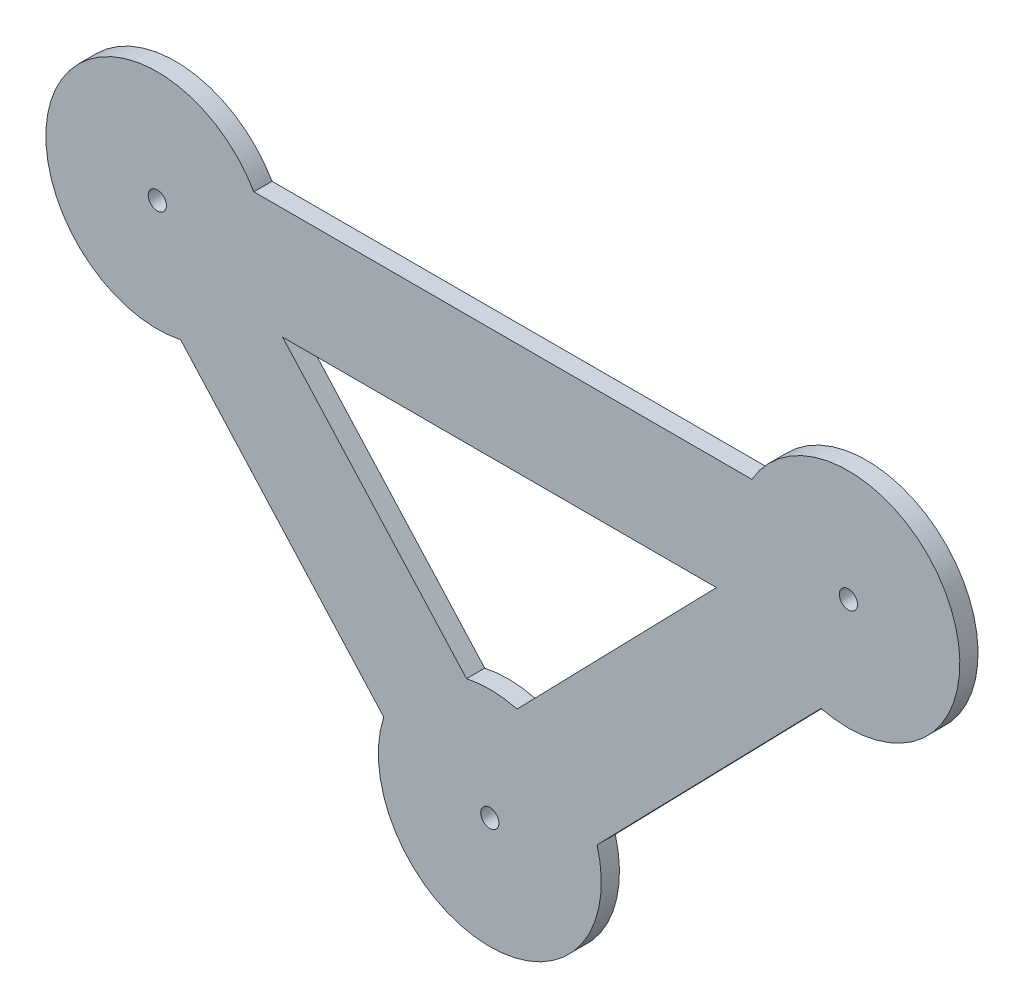
ISO-10303-21;
HEADER;
FILE_DESCRIPTION(('STEP AP214'),'2;1');
FILE_NAME('part.step','',(''),(''),'','','');
FILE_SCHEMA(('AUTOMOTIVE_DESIGN { 1 0 10303 214 1 1 1 1 }'));
ENDSEC;
DATA;
#1=APPLICATION_CONTEXT('core data for automotive mechanical design processes');
#2=APPLICATION_PROTOCOL_DEFINITION('international standard','automotive_design',2000,#1);
#3=PRODUCT_CONTEXT('',#1,'mechanical');
#4=PRODUCT('Part','Part','',(#3));
#5=PRODUCT_RELATED_PRODUCT_CATEGORY('part','',(#4));
#6=PRODUCT_DEFINITION_FORMATION('','',#4);
#7=PRODUCT_DEFINITION_CONTEXT('part definition',#1,'design');
#8=PRODUCT_DEFINITION('design','',#6,#7);
#9=PRODUCT_DEFINITION_SHAPE('','',#8);
#10=(LENGTH_UNIT() NAMED_UNIT(*) SI_UNIT(.MILLI.,.METRE.));
#11=(NAMED_UNIT(*) PLANE_ANGLE_UNIT() SI_UNIT($,.RADIAN.));
#12=(NAMED_UNIT(*) SI_UNIT($,.STERADIAN.) SOLID_ANGLE_UNIT());
#13=UNCERTAINTY_MEASURE_WITH_UNIT(LENGTH_MEASURE(1.E-05),#10,'distance_accuracy_value','');
#14=(GEOMETRIC_REPRESENTATION_CONTEXT(3) GLOBAL_UNCERTAINTY_ASSIGNED_CONTEXT((#13)) GLOBAL_UNIT_ASSIGNED_CONTEXT((#10,
#11,#12)) REPRESENTATION_CONTEXT('',''));
#15=CARTESIAN_POINT('',(0.,0.,0.));
#16=DIRECTION('',(0.,0.,1.));
#17=DIRECTION('',(1.,0.,0.));
#18=AXIS2_PLACEMENT_3D('',#15,#16,#17);
#19=CARTESIAN_POINT('',(0.115447477742822,-196.315098422538,-6.223));
#20=DIRECTION('',(-0.716755800865659,0.697324258810367,0.));
#21=DIRECTION('',(-0.697324258810367,-0.716755800865659,0.));
#22=AXIS2_PLACEMENT_3D('',#19,#20,#21);
#23=PLANE('',#22);
#24=DIRECTION('',(-0.697324258810367,-0.716755800865659,0.));
#25=VECTOR('',#24,1.);
#26=CARTESIAN_POINT('',(0.115447477742822,-196.315098422538,0.));
#27=LINE('',#26,#25);
#28=CARTESIAN_POINT('',(191.108363524528,0.,0.));
#29=VERTEX_POINT('',#28);
#30=CARTESIAN_POINT('',(123.007121589797,-69.9989417923698,0.));
#31=VERTEX_POINT('',#30);
#32=EDGE_CURVE('E169',#29,#31,#27,.T.);
#33=ORIENTED_EDGE('',*,*,#32,.F.);
#34=DIRECTION('',(0.,0.,1.));
#35=VECTOR('',#34,1.);
#36=CARTESIAN_POINT('',(191.108363524528,0.,-6.223));
#37=LINE('',#36,#35);
#38=CARTESIAN_POINT('',(191.108363524528,0.,-6.223));
#39=VERTEX_POINT('',#38);
#40=EDGE_CURVE('E11',#39,#29,#37,.T.);
#41=ORIENTED_EDGE('',*,*,#40,.F.);
#42=DIRECTION('',(-0.697324258810367,-0.716755800865659,0.));
#43=VECTOR('',#42,1.);
#44=CARTESIAN_POINT('',(0.115447477742822,-196.315098422538,-6.223));
#45=LINE('',#44,#43);
#46=CARTESIAN_POINT('',(123.007121589797,-69.9989417923698,-6.223));
#47=VERTEX_POINT('',#46);
#48=EDGE_CURVE('E135',#39,#47,#45,.T.);
#49=ORIENTED_EDGE('',*,*,#48,.T.);
#50=DIRECTION('',(0.,0.,1.));
#51=VECTOR('',#50,1.);
#52=CARTESIAN_POINT('',(123.007121589797,-69.9989417923698,-6.223));
#53=LINE('',#52,#51);
#54=EDGE_CURVE('E132',#47,#31,#53,.T.);
#55=ORIENTED_EDGE('',*,*,#54,.T.);
#56=EDGE_LOOP('',(#33,#41,#49,#55));
#57=FACE_BOUND('',#56,.T.);
#58=ADVANCED_FACE('F31',(#57),#23,.T.);
#59=CARTESIAN_POINT('',(118.11,0.,-6.223));
#60=DIRECTION('',(0.,-1.,0.));
#61=DIRECTION('',(0.,0.,-1.));
#62=AXIS2_PLACEMENT_3D('',#59,#60,#61);
#63=PLANE('',#62);
#64=DIRECTION('',(1.,0.,0.));
#65=VECTOR('',#64,1.);
#66=CARTESIAN_POINT('',(118.11,0.,0.));
#67=LINE('',#66,#65);
#68=CARTESIAN_POINT('',(42.8418686024924,0.,0.));
#69=VERTEX_POINT('',#68);
#70=EDGE_CURVE('E175',#69,#29,#67,.T.);
#71=ORIENTED_EDGE('',*,*,#70,.F.);
#72=DIRECTION('',(0.,0.,1.));
#73=VECTOR('',#72,1.);
#74=CARTESIAN_POINT('',(42.8418686024924,0.,-6.223));
#75=LINE('',#74,#73);
#76=CARTESIAN_POINT('',(42.8418686024924,0.,-6.223));
#77=VERTEX_POINT('',#76);
#78=EDGE_CURVE('E41',#77,#69,#75,.T.);
#79=ORIENTED_EDGE('',*,*,#78,.F.);
#80=DIRECTION('',(1.,0.,0.));
#81=VECTOR('',#80,1.);
#82=CARTESIAN_POINT('',(118.11,0.,-6.223));
#83=LINE('',#82,#81);
#84=EDGE_CURVE('E124',#77,#39,#83,.T.);
#85=ORIENTED_EDGE('',*,*,#84,.T.);
#86=ORIENTED_EDGE('',*,*,#40,.T.);
#87=EDGE_LOOP('',(#71,#79,#85,#86));
#88=FACE_BOUND('',#87,.T.);
#89=ADVANCED_FACE('F254',(#88),#63,.T.);
#90=CARTESIAN_POINT('',(231.347283424665,-208.9561043141,-6.223));
#91=DIRECTION('',(-0.742507506285982,-0.669837743867104,0.));
#92=DIRECTION('',(0.669837743867104,-0.742507506285982,0.));
#93=AXIS2_PLACEMENT_3D('',#90,#91,#92);
#94=PLANE('',#93);
#95=DIRECTION('',(0.669837743867104,-0.742507506285982,0.));
#96=VECTOR('',#95,1.);
#97=CARTESIAN_POINT('',(231.347283424665,-208.9561043141,0.));
#98=LINE('',#97,#96);
#99=CARTESIAN_POINT('',(105.695800923009,-69.6728677577091,0.));
#100=VERTEX_POINT('',#99);
#101=EDGE_CURVE('E128',#69,#100,#98,.T.);
#102=ORIENTED_EDGE('',*,*,#101,.T.);
#103=DIRECTION('',(0.,0.,1.));
#104=VECTOR('',#103,1.);
#105=CARTESIAN_POINT('',(105.695800923009,-69.6728677577091,-6.223));
#106=LINE('',#105,#104);
#107=CARTESIAN_POINT('',(105.695800923009,-69.6728677577091,-6.223));
#108=VERTEX_POINT('',#107);
#109=EDGE_CURVE('E126',#108,#100,#106,.T.);
#110=ORIENTED_EDGE('',*,*,#109,.F.);
#111=DIRECTION('',(0.669837743867104,-0.742507506285982,0.));
#112=VECTOR('',#111,1.);
#113=CARTESIAN_POINT('',(231.347283424665,-208.9561043141,-6.223));
#114=LINE('',#113,#112);
#115=EDGE_CURVE('E118',#77,#108,#114,.T.);
#116=ORIENTED_EDGE('',*,*,#115,.F.);
#117=ORIENTED_EDGE('',*,*,#78,.T.);
#118=EDGE_LOOP('',(#102,#110,#116,#117));
#119=FACE_BOUND('',#118,.T.);
#120=ADVANCED_FACE('F127',(#119),#94,.F.);
#121=CARTESIAN_POINT('',(113.652709677419,-106.932733606555,-6.223));
#122=DIRECTION('',(0.,0.,1.));
#123=DIRECTION('',(1.,0.,0.));
#124=AXIS2_PLACEMENT_3D('',#121,#122,#123);
#125=CYLINDRICAL_SURFACE('',#124,38.1);
#126=CARTESIAN_POINT('',(113.652709677419,-106.932733606555,0.));
#127=DIRECTION('',(0.,0.,1.));
#128=DIRECTION('',(1.,0.,0.));
#129=AXIS2_PLACEMENT_3D('',#126,#127,#128);
#130=CIRCLE('',#129,38.1);
#131=CARTESIAN_POINT('',(77.4062649335136,-95.1936857990458,0.));
#132=VERTEX_POINT('',#131);
#133=CARTESIAN_POINT('',(150.315517602778,-96.5669960530449,0.));
#134=VERTEX_POINT('',#133);
#135=EDGE_CURVE('E148',#132,#134,#130,.T.);
#136=ORIENTED_EDGE('',*,*,#135,.F.);
#137=DIRECTION('',(0.,0.,1.));
#138=VECTOR('',#137,1.);
#139=CARTESIAN_POINT('',(77.4062649335136,-95.1936857990458,-6.223));
#140=LINE('',#139,#138);
#141=CARTESIAN_POINT('',(77.4062649335136,-95.1936857990458,-6.223));
#142=VERTEX_POINT('',#141);
#143=EDGE_CURVE('E187',#142,#132,#140,.T.);
#144=ORIENTED_EDGE('',*,*,#143,.F.);
#145=CARTESIAN_POINT('',(113.652709677419,-106.932733606555,-6.223));
#146=DIRECTION('',(0.,0.,1.));
#147=DIRECTION('',(1.,0.,0.));
#148=AXIS2_PLACEMENT_3D('',#145,#146,#147);
#149=CIRCLE('',#148,38.1);
#150=CARTESIAN_POINT('',(150.315517602778,-96.5669960530449,-6.223));
#151=VERTEX_POINT('',#150);
#152=EDGE_CURVE('E183',#142,#151,#149,.T.);
#153=ORIENTED_EDGE('',*,*,#152,.T.);
#154=DIRECTION('',(0.,0.,1.));
#155=VECTOR('',#154,1.);
#156=CARTESIAN_POINT('',(150.315517602778,-96.5669960530449,-6.223));
#157=LINE('',#156,#155);
#158=EDGE_CURVE('E35',#151,#134,#157,.T.);
#159=ORIENTED_EDGE('',*,*,#158,.T.);
#160=EDGE_LOOP('',(#136,#144,#153,#159));
#161=FACE_BOUND('',#160,.T.);
#162=ADVANCED_FACE('F33',(#161),#125,.T.);
#163=CARTESIAN_POINT('',(203.057747435169,-234.476922355436,-6.223));
#164=DIRECTION('',(-0.742507506285982,-0.669837743867104,0.));
#165=DIRECTION('',(0.669837743867104,-0.742507506285982,0.));
#166=AXIS2_PLACEMENT_3D('',#163,#164,#165);
#167=PLANE('',#166);
#168=DIRECTION('',(0.669837743867104,-0.742507506285982,0.));
#169=VECTOR('',#168,1.);
#170=CARTESIAN_POINT('',(203.057747435169,-234.476922355436,0.));
#171=LINE('',#170,#169);
#172=CARTESIAN_POINT('',(7.95690875440982,-18.209865848846,0.));
#173=VERTEX_POINT('',#172);
#174=EDGE_CURVE('E163',#173,#132,#171,.T.);
#175=ORIENTED_EDGE('',*,*,#174,.F.);
#176=DIRECTION('',(0.,0.,1.));
#177=VECTOR('',#176,1.);
#178=CARTESIAN_POINT('',(7.95690875440982,-18.209865848846,-6.223));
#179=LINE('',#178,#177);
#180=CARTESIAN_POINT('',(7.95690875440982,-18.209865848846,-6.223));
#181=VERTEX_POINT('',#180);
#182=EDGE_CURVE('E189',#181,#173,#179,.T.);
#183=ORIENTED_EDGE('',*,*,#182,.F.);
#184=DIRECTION('',(0.669837743867104,-0.742507506285982,0.));
#185=VECTOR('',#184,1.);
#186=CARTESIAN_POINT('',(203.057747435169,-234.476922355436,-6.223));
#187=LINE('',#186,#185);
#188=EDGE_CURVE('E213',#181,#142,#187,.T.);
#189=ORIENTED_EDGE('',*,*,#188,.T.);
#190=ORIENTED_EDGE('',*,*,#143,.T.);
#191=EDGE_LOOP('',(#175,#183,#189,#190));
#192=FACE_BOUND('',#191,.T.);
#193=ADVANCED_FACE('F209',(#192),#167,.T.);
#194=CARTESIAN_POINT('',(0.,19.05,-6.223));
#195=DIRECTION('',(0.,0.,1.));
#196=DIRECTION('',(1.,0.,0.));
#197=AXIS2_PLACEMENT_3D('',#194,#195,#196);
#198=CYLINDRICAL_SURFACE('',#197,38.1);
#199=CARTESIAN_POINT('',(0.,19.05,0.));
#200=DIRECTION('',(0.,0.,1.));
#201=DIRECTION('',(1.,0.,0.));
#202=AXIS2_PLACEMENT_3D('',#199,#200,#201);
#203=CIRCLE('',#202,38.1);
#204=CARTESIAN_POINT('',(32.9955678841871,38.1,0.));
#205=VERTEX_POINT('',#204);
#206=EDGE_CURVE('E160',#205,#173,#203,.T.);
#207=ORIENTED_EDGE('',*,*,#206,.F.);
#208=DIRECTION('',(0.,0.,1.));
#209=VECTOR('',#208,1.);
#210=CARTESIAN_POINT('',(32.9955678841871,38.1,-6.223));
#211=LINE('',#210,#209);
#212=CARTESIAN_POINT('',(32.9955678841871,38.1,-6.223));
#213=VERTEX_POINT('',#212);
#214=EDGE_CURVE('E191',#213,#205,#211,.T.);
#215=ORIENTED_EDGE('',*,*,#214,.F.);
#216=CARTESIAN_POINT('',(0.,19.05,-6.223));
#217=DIRECTION('',(0.,0.,1.));
#218=DIRECTION('',(1.,0.,0.));
#219=AXIS2_PLACEMENT_3D('',#216,#217,#218);
#220=CIRCLE('',#219,38.1);
#221=EDGE_CURVE('E224',#213,#181,#220,.T.);
#222=ORIENTED_EDGE('',*,*,#221,.T.);
#223=ORIENTED_EDGE('',*,*,#182,.T.);
#224=EDGE_LOOP('',(#207,#215,#222,#223));
#225=FACE_BOUND('',#224,.T.);
#226=ADVANCED_FACE('F265',(#225),#198,.T.);
#227=CARTESIAN_POINT('',(118.11,38.1,-6.223));
#228=DIRECTION('',(0.,-1.,0.));
#229=DIRECTION('',(0.,0.,-1.));
#230=AXIS2_PLACEMENT_3D('',#227,#228,#229);
#231=PLANE('',#230);
#232=DIRECTION('',(1.,0.,0.));
#233=VECTOR('',#232,1.);
#234=CARTESIAN_POINT('',(118.11,38.1,0.));
#235=LINE('',#234,#233);
#236=CARTESIAN_POINT('',(203.224432115813,38.1,0.));
#237=VERTEX_POINT('',#236);
#238=EDGE_CURVE('E157',#205,#237,#235,.T.);
#239=ORIENTED_EDGE('',*,*,#238,.T.);
#240=DIRECTION('',(0.,0.,1.));
#241=VECTOR('',#240,1.);
#242=CARTESIAN_POINT('',(203.224432115813,38.1,-6.223));
#243=LINE('',#242,#241);
#244=CARTESIAN_POINT('',(203.224432115813,38.1,-6.223));
#245=VERTEX_POINT('',#244);
#246=EDGE_CURVE('E193',#245,#237,#243,.T.);
#247=ORIENTED_EDGE('',*,*,#246,.F.);
#248=DIRECTION('',(1.,0.,0.));
#249=VECTOR('',#248,1.);
#250=CARTESIAN_POINT('',(118.11,38.1,-6.223));
#251=LINE('',#250,#249);
#252=EDGE_CURVE('E222',#213,#245,#251,.T.);
#253=ORIENTED_EDGE('',*,*,#252,.F.);
#254=ORIENTED_EDGE('',*,*,#214,.T.);
#255=EDGE_LOOP('',(#239,#247,#253,#254));
#256=FACE_BOUND('',#255,.T.);
#257=ADVANCED_FACE('F268',(#256),#231,.F.);
#258=CARTESIAN_POINT('',(236.22,19.05,-6.223));
#259=DIRECTION('',(0.,0.,1.));
#260=DIRECTION('',(1.,0.,0.));
#261=AXIS2_PLACEMENT_3D('',#258,#259,#260);
#262=CYLINDRICAL_SURFACE('',#261,38.1);
#263=CARTESIAN_POINT('',(236.22,19.05,0.));
#264=DIRECTION('',(0.,0.,1.));
#265=DIRECTION('',(1.,0.,0.));
#266=AXIS2_PLACEMENT_3D('',#263,#264,#265);
#267=CIRCLE('',#266,38.1);
#268=CARTESIAN_POINT('',(226.865588087623,-17.8837918141853,0.));
#269=VERTEX_POINT('',#268);
#270=EDGE_CURVE('E154',#269,#237,#267,.T.);
#271=ORIENTED_EDGE('',*,*,#270,.F.);
#272=DIRECTION('',(0.,0.,1.));
#273=VECTOR('',#272,1.);
#274=CARTESIAN_POINT('',(226.865588087623,-17.8837918141853,-6.223));
#275=LINE('',#274,#273);
#276=CARTESIAN_POINT('',(226.865588087623,-17.8837918141853,-6.223));
#277=VERTEX_POINT('',#276);
#278=EDGE_CURVE('E194',#277,#269,#275,.T.);
#279=ORIENTED_EDGE('',*,*,#278,.F.);
#280=CARTESIAN_POINT('',(236.22,19.05,-6.223));
#281=DIRECTION('',(0.,0.,1.));
#282=DIRECTION('',(1.,0.,0.));
#283=AXIS2_PLACEMENT_3D('',#280,#281,#282);
#284=CIRCLE('',#283,38.1);
#285=EDGE_CURVE('E217',#277,#245,#284,.T.);
#286=ORIENTED_EDGE('',*,*,#285,.T.);
#287=ORIENTED_EDGE('',*,*,#246,.T.);
#288=EDGE_LOOP('',(#271,#279,#286,#287));
#289=FACE_BOUND('',#288,.T.);
#290=ADVANCED_FACE('F272',(#289),#262,.T.);
#291=CARTESIAN_POINT('',(236.22,19.05,-6.223));
#292=DIRECTION('',(0.,0.,1.));
#293=DIRECTION('',(1.,0.,0.));
#294=AXIS2_PLACEMENT_3D('',#291,#292,#293);
#295=CYLINDRICAL_SURFACE('',#294,3.11149999999999);
#296=CARTESIAN_POINT('',(236.22,19.05,-6.223));
#297=DIRECTION('',(0.,0.,1.));
#298=DIRECTION('',(1.,0.,0.));
#299=AXIS2_PLACEMENT_3D('',#296,#297,#298);
#300=CIRCLE('',#299,3.11149999999999);
#301=CARTESIAN_POINT('',(239.3315,19.05,-6.223));
#302=VERTEX_POINT('',#301);
#303=EDGE_CURVE('E142',#302,#302,#300,.T.);
#304=ORIENTED_EDGE('',*,*,#303,.F.);
#305=EDGE_LOOP('',(#304));
#306=FACE_BOUND('',#305,.T.);
#307=CARTESIAN_POINT('',(236.22,19.05,0.));
#308=DIRECTION('',(0.,0.,1.));
#309=DIRECTION('',(1.,0.,0.));
#310=AXIS2_PLACEMENT_3D('',#307,#308,#309);
#311=CIRCLE('',#310,3.11149999999999);
#312=CARTESIAN_POINT('',(239.3315,19.05,0.));
#313=VERTEX_POINT('',#312);
#314=EDGE_CURVE('E178',#313,#313,#311,.T.);
#315=ORIENTED_EDGE('',*,*,#314,.T.);
#316=EDGE_LOOP('',(#315));
#317=FACE_BOUND('',#316,.T.);
#318=ADVANCED_FACE('F275',(#306,#317),#295,.F.);
#319=CARTESIAN_POINT('',(113.652709677419,-106.932733606555,-6.223));
#320=DIRECTION('',(0.,0.,1.));
#321=DIRECTION('',(1.,0.,0.));
#322=AXIS2_PLACEMENT_3D('',#319,#320,#321);
#323=CYLINDRICAL_SURFACE('',#322,38.1);
#324=CARTESIAN_POINT('',(113.652709677419,-106.932733606555,0.));
#325=DIRECTION('',(0.,0.,1.));
#326=DIRECTION('',(1.,0.,0.));
#327=AXIS2_PLACEMENT_3D('',#324,#325,#326);
#328=CIRCLE('',#327,38.1);
#329=EDGE_CURVE('E172',#31,#100,#328,.T.);
#330=ORIENTED_EDGE('',*,*,#329,.F.);
#331=ORIENTED_EDGE('',*,*,#54,.F.);
#332=CARTESIAN_POINT('',(113.652709677419,-106.932733606555,-6.223));
#333=DIRECTION('',(0.,0.,1.));
#334=DIRECTION('',(1.,0.,0.));
#335=AXIS2_PLACEMENT_3D('',#332,#333,#334);
#336=CIRCLE('',#335,38.1);
#337=EDGE_CURVE('E123',#47,#108,#336,.T.);
#338=ORIENTED_EDGE('',*,*,#337,.T.);
#339=ORIENTED_EDGE('',*,*,#109,.T.);
#340=EDGE_LOOP('',(#330,#331,#338,#339));
#341=FACE_BOUND('',#340,.T.);
#342=ADVANCED_FACE('F134',(#341),#323,.T.);
#343=CARTESIAN_POINT('',(113.652709677419,-106.932733606555,-6.223));
#344=DIRECTION('',(0.,0.,1.));
#345=DIRECTION('',(1.,0.,0.));
#346=AXIS2_PLACEMENT_3D('',#343,#344,#345);
#347=CYLINDRICAL_SURFACE('',#346,3.1115);
#348=CARTESIAN_POINT('',(113.652709677419,-106.932733606555,-6.223));
#349=DIRECTION('',(0.,0.,1.));
#350=DIRECTION('',(1.,0.,0.));
#351=AXIS2_PLACEMENT_3D('',#348,#349,#350);
#352=CIRCLE('',#351,3.1115);
#353=CARTESIAN_POINT('',(116.764209677419,-106.932733606555,-6.223));
#354=VERTEX_POINT('',#353);
#355=EDGE_CURVE('E137',#354,#354,#352,.T.);
#356=ORIENTED_EDGE('',*,*,#355,.F.);
#357=EDGE_LOOP('',(#356));
#358=FACE_BOUND('',#357,.T.);
#359=CARTESIAN_POINT('',(113.652709677419,-106.932733606555,0.));
#360=DIRECTION('',(0.,0.,1.));
#361=DIRECTION('',(1.,0.,0.));
#362=AXIS2_PLACEMENT_3D('',#359,#360,#361);
#363=CIRCLE('',#362,3.1115);
#364=CARTESIAN_POINT('',(116.764209677419,-106.932733606555,0.));
#365=VERTEX_POINT('',#364);
#366=EDGE_CURVE('E166',#365,#365,#363,.T.);
#367=ORIENTED_EDGE('',*,*,#366,.T.);
#368=EDGE_LOOP('',(#367));
#369=FACE_BOUND('',#368,.T.);
#370=ADVANCED_FACE('F229',(#358,#369),#347,.F.);
#371=CARTESIAN_POINT('',(27.4238434907244,-222.883152683213,-6.223));
#372=DIRECTION('',(-0.716755800865658,0.697324258810368,0.));
#373=DIRECTION('',(-0.697324258810368,-0.716755800865658,0.));
#374=AXIS2_PLACEMENT_3D('',#371,#372,#373);
#375=PLANE('',#374);
#376=DIRECTION('',(-0.697324258810368,-0.716755800865658,0.));
#377=VECTOR('',#376,1.);
#378=CARTESIAN_POINT('',(27.4238434907244,-222.883152683213,0.));
#379=LINE('',#378,#377);
#380=EDGE_CURVE('E151',#269,#134,#379,.T.);
#381=ORIENTED_EDGE('',*,*,#380,.T.);
#382=ORIENTED_EDGE('',*,*,#158,.F.);
#383=DIRECTION('',(-0.697324258810368,-0.716755800865658,0.));
#384=VECTOR('',#383,1.);
#385=CARTESIAN_POINT('',(27.4238434907244,-222.883152683213,-6.223));
#386=LINE('',#385,#384);
#387=EDGE_CURVE('E95',#277,#151,#386,.T.);
#388=ORIENTED_EDGE('',*,*,#387,.F.);
#389=ORIENTED_EDGE('',*,*,#278,.T.);
#390=EDGE_LOOP('',(#381,#382,#388,#389));
#391=FACE_BOUND('',#390,.T.);
#392=ADVANCED_FACE('F200',(#391),#375,.F.);
#393=CARTESIAN_POINT('',(0.,19.05,-6.223));
#394=DIRECTION('',(0.,0.,1.));
#395=DIRECTION('',(1.,0.,0.));
#396=AXIS2_PLACEMENT_3D('',#393,#394,#395);
#397=CYLINDRICAL_SURFACE('',#396,3.1115);
#398=CARTESIAN_POINT('',(0.,19.05,-6.223));
#399=DIRECTION('',(0.,0.,1.));
#400=DIRECTION('',(1.,0.,0.));
#401=AXIS2_PLACEMENT_3D('',#398,#399,#400);
#402=CIRCLE('',#401,3.1115);
#403=CARTESIAN_POINT('',(3.1115,19.05,-6.223));
#404=VERTEX_POINT('',#403);
#405=EDGE_CURVE('E145',#404,#404,#402,.T.);
#406=ORIENTED_EDGE('',*,*,#405,.F.);
#407=EDGE_LOOP('',(#406));
#408=FACE_BOUND('',#407,.T.);
#409=CARTESIAN_POINT('',(0.,19.05,0.));
#410=DIRECTION('',(0.,0.,1.));
#411=DIRECTION('',(1.,0.,0.));
#412=AXIS2_PLACEMENT_3D('',#409,#410,#411);
#413=CIRCLE('',#412,3.1115);
#414=CARTESIAN_POINT('',(3.1115,19.05,0.));
#415=VERTEX_POINT('',#414);
#416=EDGE_CURVE('E181',#415,#415,#413,.T.);
#417=ORIENTED_EDGE('',*,*,#416,.T.);
#418=EDGE_LOOP('',(#417));
#419=FACE_BOUND('',#418,.T.);
#420=ADVANCED_FACE('F242',(#408,#419),#397,.F.);
#421=CARTESIAN_POINT('',(118.11,-311.110770507606,-6.223));
#422=DIRECTION('',(0.,0.,1.));
#423=DIRECTION('',(1.,0.,0.));
#424=AXIS2_PLACEMENT_3D('',#421,#422,#423);
#425=PLANE('',#424);
#426=ORIENTED_EDGE('',*,*,#152,.F.);
#427=ORIENTED_EDGE('',*,*,#188,.F.);
#428=ORIENTED_EDGE('',*,*,#221,.F.);
#429=ORIENTED_EDGE('',*,*,#252,.T.);
#430=ORIENTED_EDGE('',*,*,#285,.F.);
#431=ORIENTED_EDGE('',*,*,#387,.T.);
#432=EDGE_LOOP('',(#426,#427,#428,#429,#430,#431));
#433=FACE_BOUND('',#432,.T.);
#434=ORIENTED_EDGE('',*,*,#355,.T.);
#435=EDGE_LOOP('',(#434));
#436=FACE_BOUND('',#435,.T.);
#437=ORIENTED_EDGE('',*,*,#48,.F.);
#438=ORIENTED_EDGE('',*,*,#84,.F.);
#439=ORIENTED_EDGE('',*,*,#115,.T.);
#440=ORIENTED_EDGE('',*,*,#337,.F.);
#441=EDGE_LOOP('',(#437,#438,#439,#440));
#442=FACE_BOUND('',#441,.T.);
#443=ORIENTED_EDGE('',*,*,#303,.T.);
#444=EDGE_LOOP('',(#443));
#445=FACE_BOUND('',#444,.T.);
#446=ORIENTED_EDGE('',*,*,#405,.T.);
#447=EDGE_LOOP('',(#446));
#448=FACE_BOUND('',#447,.T.);
#449=ADVANCED_FACE('F120',(#433,#436,#442,#445,#448),#425,.F.);
#450=CARTESIAN_POINT('',(118.11,-311.110770507606,0.));
#451=DIRECTION('',(0.,0.,1.));
#452=DIRECTION('',(1.,0.,0.));
#453=AXIS2_PLACEMENT_3D('',#450,#451,#452);
#454=PLANE('',#453);
#455=ORIENTED_EDGE('',*,*,#135,.T.);
#456=ORIENTED_EDGE('',*,*,#380,.F.);
#457=ORIENTED_EDGE('',*,*,#270,.T.);
#458=ORIENTED_EDGE('',*,*,#238,.F.);
#459=ORIENTED_EDGE('',*,*,#206,.T.);
#460=ORIENTED_EDGE('',*,*,#174,.T.);
#461=EDGE_LOOP('',(#455,#456,#457,#458,#459,#460));
#462=FACE_BOUND('',#461,.T.);
#463=ORIENTED_EDGE('',*,*,#366,.F.);
#464=EDGE_LOOP('',(#463));
#465=FACE_BOUND('',#464,.T.);
#466=ORIENTED_EDGE('',*,*,#32,.T.);
#467=ORIENTED_EDGE('',*,*,#329,.T.);
#468=ORIENTED_EDGE('',*,*,#101,.F.);
#469=ORIENTED_EDGE('',*,*,#70,.T.);
#470=EDGE_LOOP('',(#466,#467,#468,#469));
#471=FACE_BOUND('',#470,.T.);
#472=ORIENTED_EDGE('',*,*,#314,.F.);
#473=EDGE_LOOP('',(#472));
#474=FACE_BOUND('',#473,.T.);
#475=ORIENTED_EDGE('',*,*,#416,.F.);
#476=EDGE_LOOP('',(#475));
#477=FACE_BOUND('',#476,.T.);
#478=ADVANCED_FACE('F203',(#462,#465,#471,#474,#477),#454,.T.);
#479=CLOSED_SHELL('',(#58,#89,#120,#162,#193,#226,#257,#290,#318,#342,#370,#392,#420,#449,#478));
#480=MANIFOLD_SOLID_BREP('B2',#479);
#481=ADVANCED_BREP_SHAPE_REPRESENTATION('',(#18,#480),#14);
#482=SHAPE_DEFINITION_REPRESENTATION(#9,#481);
ENDSEC;
END-ISO-10303-21;
